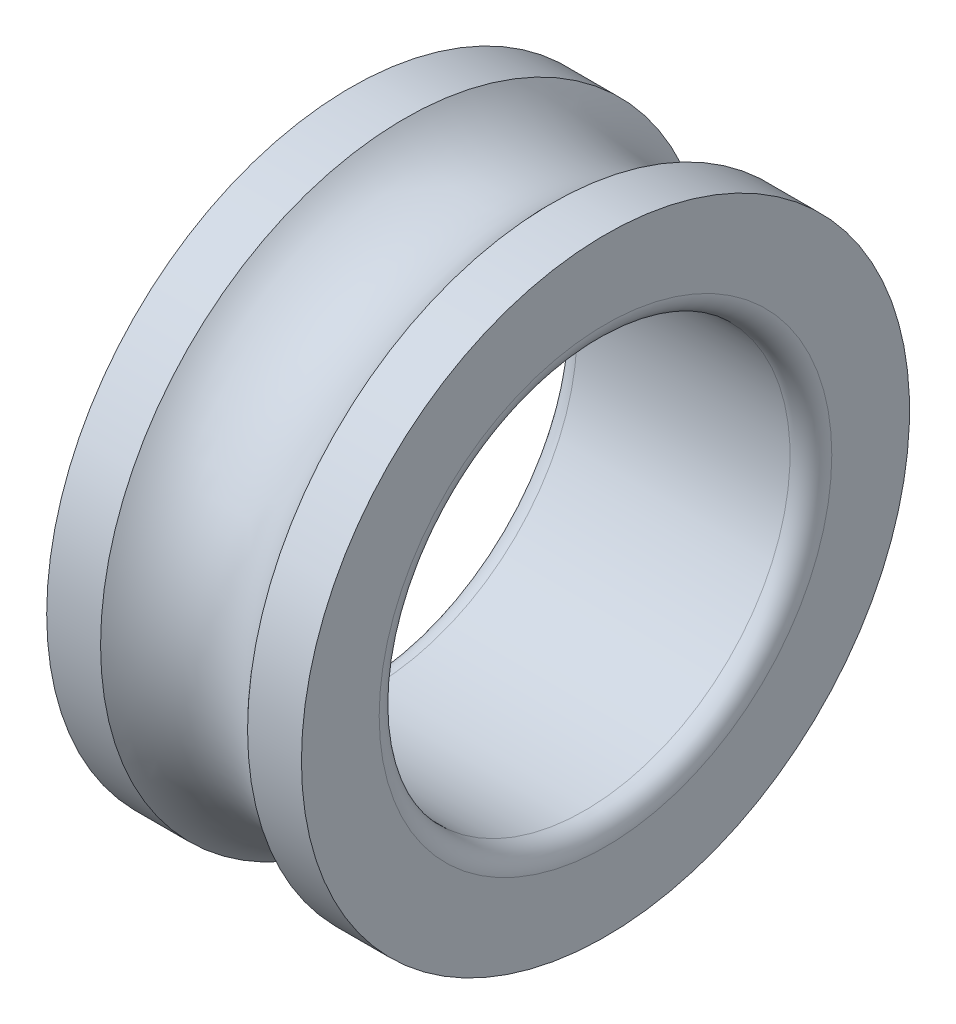
ISO-10303-21;
HEADER;
FILE_DESCRIPTION(('STEP AP214'),'2;1');
FILE_NAME('part.step','',(''),(''),'','','');
FILE_SCHEMA(('AUTOMOTIVE_DESIGN { 1 0 10303 214 1 1 1 1 }'));
ENDSEC;
DATA;
#1=APPLICATION_CONTEXT('core data for automotive mechanical design processes');
#2=APPLICATION_PROTOCOL_DEFINITION('international standard','automotive_design',2000,#1);
#3=PRODUCT_CONTEXT('',#1,'mechanical');
#4=PRODUCT('Part','Part','',(#3));
#5=PRODUCT_RELATED_PRODUCT_CATEGORY('part','',(#4));
#6=PRODUCT_DEFINITION_FORMATION('','',#4);
#7=PRODUCT_DEFINITION_CONTEXT('part definition',#1,'design');
#8=PRODUCT_DEFINITION('design','',#6,#7);
#9=PRODUCT_DEFINITION_SHAPE('','',#8);
#10=(LENGTH_UNIT() NAMED_UNIT(*) SI_UNIT(.MILLI.,.METRE.));
#11=(NAMED_UNIT(*) PLANE_ANGLE_UNIT() SI_UNIT($,.RADIAN.));
#12=(NAMED_UNIT(*) SI_UNIT($,.STERADIAN.) SOLID_ANGLE_UNIT());
#13=UNCERTAINTY_MEASURE_WITH_UNIT(LENGTH_MEASURE(1.E-05),#10,'distance_accuracy_value','');
#14=(GEOMETRIC_REPRESENTATION_CONTEXT(3) GLOBAL_UNCERTAINTY_ASSIGNED_CONTEXT((#13)) GLOBAL_UNIT_ASSIGNED_CONTEXT((#10,
#11,#12)) REPRESENTATION_CONTEXT('',''));
#15=CARTESIAN_POINT('',(0.,0.,0.));
#16=DIRECTION('',(0.,0.,1.));
#17=DIRECTION('',(1.,0.,0.));
#18=AXIS2_PLACEMENT_3D('',#15,#16,#17);
#19=CARTESIAN_POINT('',(-1.085,2.59,0.));
#20=DIRECTION('',(1.,0.,0.));
#21=DIRECTION('',(0.,0.,-1.));
#22=AXIS2_PLACEMENT_3D('',#19,#20,#21);
#23=PLANE('',#22);
#24=CARTESIAN_POINT('',(-1.085,0.,0.));
#25=DIRECTION('',(-1.,0.,0.));
#26=DIRECTION('',(0.,0.,1.));
#27=AXIS2_PLACEMENT_3D('',#24,#25,#26);
#28=CIRCLE('',#27,1.9278);
#29=CARTESIAN_POINT('',(-1.085,0.,1.9278));
#30=VERTEX_POINT('',#29);
#31=EDGE_CURVE('E10',#30,#30,#28,.T.);
#32=ORIENTED_EDGE('',*,*,#31,.F.);
#33=EDGE_LOOP('',(#32));
#34=FACE_BOUND('',#33,.T.);
#35=CARTESIAN_POINT('',(-1.085,0.,0.));
#36=DIRECTION('',(-1.,0.,0.));
#37=DIRECTION('',(0.,0.,1.));
#38=AXIS2_PLACEMENT_3D('',#35,#36,#37);
#39=CIRCLE('',#38,2.59);
#40=CARTESIAN_POINT('',(-1.085,0.,2.59));
#41=VERTEX_POINT('',#40);
#42=EDGE_CURVE('E63',#41,#41,#39,.T.);
#43=ORIENTED_EDGE('',*,*,#42,.T.);
#44=EDGE_LOOP('',(#43));
#45=FACE_BOUND('',#44,.T.);
#46=ADVANCED_FACE('F35',(#34,#45),#23,.F.);
#47=CARTESIAN_POINT('',(-0.9072,0.,0.));
#48=DIRECTION('',(-1.,0.,0.));
#49=DIRECTION('',(0.,0.,1.));
#50=AXIS2_PLACEMENT_3D('',#47,#48,#49);
#51=TOROIDAL_SURFACE('',#50,1.9278,0.1778);
#52=CARTESIAN_POINT('',(-0.907199999999999,0.,0.));
#53=DIRECTION('',(-1.,0.,0.));
#54=DIRECTION('',(0.,0.,1.));
#55=AXIS2_PLACEMENT_3D('',#52,#53,#54);
#56=CIRCLE('',#55,1.75);
#57=CARTESIAN_POINT('',(-0.907199999999999,0.,1.75));
#58=VERTEX_POINT('',#57);
#59=EDGE_CURVE('E41',#58,#58,#56,.T.);
#60=ORIENTED_EDGE('',*,*,#59,.F.);
#61=EDGE_LOOP('',(#60));
#62=FACE_BOUND('',#61,.T.);
#63=ORIENTED_EDGE('',*,*,#31,.T.);
#64=EDGE_LOOP('',(#63));
#65=FACE_BOUND('',#64,.T.);
#66=ADVANCED_FACE('F100',(#62,#65),#51,.T.);
#67=CARTESIAN_POINT('',(-1.51666666666667,0.,0.));
#68=DIRECTION('',(-1.,0.,0.));
#69=DIRECTION('',(0.,0.,1.));
#70=AXIS2_PLACEMENT_3D('',#67,#68,#69);
#71=CYLINDRICAL_SURFACE('',#70,1.75);
#72=CARTESIAN_POINT('',(0.907199999999999,0.,0.));
#73=DIRECTION('',(-1.,0.,0.));
#74=DIRECTION('',(0.,0.,1.));
#75=AXIS2_PLACEMENT_3D('',#72,#73,#74);
#76=CIRCLE('',#75,1.75);
#77=CARTESIAN_POINT('',(0.907199999999999,0.,1.75));
#78=VERTEX_POINT('',#77);
#79=EDGE_CURVE('E45',#78,#78,#76,.T.);
#80=ORIENTED_EDGE('',*,*,#79,.F.);
#81=EDGE_LOOP('',(#80));
#82=FACE_BOUND('',#81,.T.);
#83=ORIENTED_EDGE('',*,*,#59,.T.);
#84=EDGE_LOOP('',(#83));
#85=FACE_BOUND('',#84,.T.);
#86=ADVANCED_FACE('F95',(#82,#85),#71,.F.);
#87=CARTESIAN_POINT('',(0.9072,0.,0.));
#88=DIRECTION('',(-1.,0.,0.));
#89=DIRECTION('',(0.,0.,1.));
#90=AXIS2_PLACEMENT_3D('',#87,#88,#89);
#91=TOROIDAL_SURFACE('',#90,1.9278,0.1778);
#92=CARTESIAN_POINT('',(1.085,0.,0.));
#93=DIRECTION('',(-1.,0.,0.));
#94=DIRECTION('',(0.,0.,1.));
#95=AXIS2_PLACEMENT_3D('',#92,#93,#94);
#96=CIRCLE('',#95,1.9278);
#97=CARTESIAN_POINT('',(1.085,0.,1.9278));
#98=VERTEX_POINT('',#97);
#99=EDGE_CURVE('E49',#98,#98,#96,.T.);
#100=ORIENTED_EDGE('',*,*,#99,.F.);
#101=EDGE_LOOP('',(#100));
#102=FACE_BOUND('',#101,.T.);
#103=ORIENTED_EDGE('',*,*,#79,.T.);
#104=EDGE_LOOP('',(#103));
#105=FACE_BOUND('',#104,.T.);
#106=ADVANCED_FACE('F89',(#102,#105),#91,.T.);
#107=CARTESIAN_POINT('',(1.085,2.59,0.));
#108=DIRECTION('',(-1.,0.,0.));
#109=DIRECTION('',(0.,0.,1.));
#110=AXIS2_PLACEMENT_3D('',#107,#108,#109);
#111=PLANE('',#110);
#112=CARTESIAN_POINT('',(1.085,0.,0.));
#113=DIRECTION('',(-1.,0.,0.));
#114=DIRECTION('',(0.,0.,1.));
#115=AXIS2_PLACEMENT_3D('',#112,#113,#114);
#116=CIRCLE('',#115,2.59);
#117=CARTESIAN_POINT('',(1.085,0.,2.59));
#118=VERTEX_POINT('',#117);
#119=EDGE_CURVE('E54',#118,#118,#116,.T.);
#120=ORIENTED_EDGE('',*,*,#119,.F.);
#121=EDGE_LOOP('',(#120));
#122=FACE_BOUND('',#121,.T.);
#123=ORIENTED_EDGE('',*,*,#99,.T.);
#124=EDGE_LOOP('',(#123));
#125=FACE_BOUND('',#124,.T.);
#126=ADVANCED_FACE('F83',(#122,#125),#111,.F.);
#127=CARTESIAN_POINT('',(-1.51666666666667,0.,0.));
#128=DIRECTION('',(-1.,0.,0.));
#129=DIRECTION('',(0.,0.,1.));
#130=AXIS2_PLACEMENT_3D('',#127,#128,#129);
#131=CYLINDRICAL_SURFACE('',#130,2.59);
#132=CARTESIAN_POINT('',(0.626099033699942,0.,0.));
#133=DIRECTION('',(-1.,0.,0.));
#134=DIRECTION('',(0.,0.,1.));
#135=AXIS2_PLACEMENT_3D('',#132,#133,#134);
#136=CIRCLE('',#135,2.59);
#137=CARTESIAN_POINT('',(0.626099033699942,0.,2.59));
#138=VERTEX_POINT('',#137);
#139=EDGE_CURVE('E57',#138,#138,#136,.T.);
#140=ORIENTED_EDGE('',*,*,#139,.F.);
#141=EDGE_LOOP('',(#140));
#142=FACE_BOUND('',#141,.T.);
#143=ORIENTED_EDGE('',*,*,#119,.T.);
#144=EDGE_LOOP('',(#143));
#145=FACE_BOUND('',#144,.T.);
#146=ADVANCED_FACE('F77',(#142,#145),#131,.T.);
#147=CARTESIAN_POINT('',(0.,0.,0.));
#148=DIRECTION('',(-1.,0.,0.));
#149=DIRECTION('',(0.,0.,1.));
#150=AXIS2_PLACEMENT_3D('',#147,#148,#149);
#151=TOROIDAL_SURFACE('',#150,3.15,0.84);
#152=CARTESIAN_POINT('',(-0.626099033699941,0.,0.));
#153=DIRECTION('',(-1.,0.,0.));
#154=DIRECTION('',(0.,0.,1.));
#155=AXIS2_PLACEMENT_3D('',#152,#153,#154);
#156=CIRCLE('',#155,2.59);
#157=CARTESIAN_POINT('',(-0.626099033699941,0.,2.59));
#158=VERTEX_POINT('',#157);
#159=EDGE_CURVE('E60',#158,#158,#156,.T.);
#160=ORIENTED_EDGE('',*,*,#159,.F.);
#161=EDGE_LOOP('',(#160));
#162=FACE_BOUND('',#161,.T.);
#163=ORIENTED_EDGE('',*,*,#139,.T.);
#164=EDGE_LOOP('',(#163));
#165=FACE_BOUND('',#164,.T.);
#166=ADVANCED_FACE('F71',(#162,#165),#151,.F.);
#167=CARTESIAN_POINT('',(-1.51666666666667,0.,0.));
#168=DIRECTION('',(-1.,0.,0.));
#169=DIRECTION('',(0.,0.,1.));
#170=AXIS2_PLACEMENT_3D('',#167,#168,#169);
#171=CYLINDRICAL_SURFACE('',#170,2.59);
#172=ORIENTED_EDGE('',*,*,#42,.F.);
#173=EDGE_LOOP('',(#172));
#174=FACE_BOUND('',#173,.T.);
#175=ORIENTED_EDGE('',*,*,#159,.T.);
#176=EDGE_LOOP('',(#175));
#177=FACE_BOUND('',#176,.T.);
#178=ADVANCED_FACE('F68',(#174,#177),#171,.T.);
#179=CLOSED_SHELL('',(#46,#66,#86,#106,#126,#146,#166,#178));
#180=MANIFOLD_SOLID_BREP('B2',#179);
#181=ADVANCED_BREP_SHAPE_REPRESENTATION('',(#18,#180),#14);
#182=SHAPE_DEFINITION_REPRESENTATION(#9,#181);
ENDSEC;
END-ISO-10303-21;
